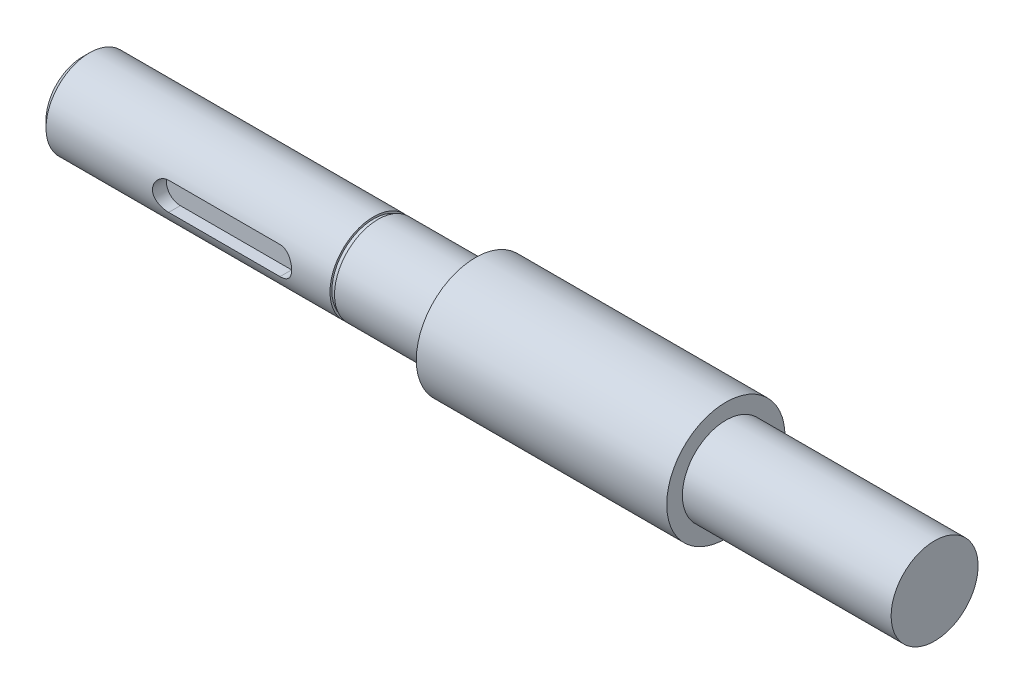
ISO-10303-21;
HEADER;
FILE_DESCRIPTION(('STEP AP214'),'2;1');
FILE_NAME('part.step','',(''),(''),'','','');
FILE_SCHEMA(('AUTOMOTIVE_DESIGN { 1 0 10303 214 1 1 1 1 }'));
ENDSEC;
DATA;
#1=APPLICATION_CONTEXT('core data for automotive mechanical design processes');
#2=APPLICATION_PROTOCOL_DEFINITION('international standard','automotive_design',2000,#1);
#3=PRODUCT_CONTEXT('',#1,'mechanical');
#4=PRODUCT('Part','Part','',(#3));
#5=PRODUCT_RELATED_PRODUCT_CATEGORY('part','',(#4));
#6=PRODUCT_DEFINITION_FORMATION('','',#4);
#7=PRODUCT_DEFINITION_CONTEXT('part definition',#1,'design');
#8=PRODUCT_DEFINITION('design','',#6,#7);
#9=PRODUCT_DEFINITION_SHAPE('','',#8);
#10=(LENGTH_UNIT() NAMED_UNIT(*) SI_UNIT(.MILLI.,.METRE.));
#11=(NAMED_UNIT(*) PLANE_ANGLE_UNIT() SI_UNIT($,.RADIAN.));
#12=(NAMED_UNIT(*) SI_UNIT($,.STERADIAN.) SOLID_ANGLE_UNIT());
#13=UNCERTAINTY_MEASURE_WITH_UNIT(LENGTH_MEASURE(1.E-05),#10,'distance_accuracy_value','');
#14=(GEOMETRIC_REPRESENTATION_CONTEXT(3) GLOBAL_UNCERTAINTY_ASSIGNED_CONTEXT((#13)) GLOBAL_UNIT_ASSIGNED_CONTEXT((#10,
#11,#12)) REPRESENTATION_CONTEXT('',''));
#15=CARTESIAN_POINT('',(0.,0.,0.));
#16=DIRECTION('',(0.,0.,1.));
#17=DIRECTION('',(1.,0.,0.));
#18=AXIS2_PLACEMENT_3D('',#15,#16,#17);
#19=CARTESIAN_POINT('',(0.,0.,0.));
#20=DIRECTION('',(-1.,0.,0.));
#21=DIRECTION('',(0.,0.,1.));
#22=AXIS2_PLACEMENT_3D('',#19,#20,#21);
#23=CYLINDRICAL_SURFACE('',#22,12.5);
#24=DIRECTION('',(-1.,0.,0.));
#25=VECTOR('',#24,1.);
#26=CARTESIAN_POINT('',(0.,4.,-11.842719282327));
#27=LINE('',#26,#25);
#28=CARTESIAN_POINT('',(7.60830044569828,4.,-11.842719282327));
#29=VERTEX_POINT('',#28);
#30=CARTESIAN_POINT('',(-24.3916995543017,4.,-11.842719282327));
#31=VERTEX_POINT('',#30);
#32=EDGE_CURVE('E47',#29,#31,#27,.T.);
#33=ORIENTED_EDGE('',*,*,#32,.T.);
#34=CARTESIAN_POINT('',(-24.3916995543017,4.,-11.842719282327));
#35=CARTESIAN_POINT('',(-24.5010993262633,4.00001410484613,-11.8427027366058));
#36=CARTESIAN_POINT('',(-24.6104897641496,3.995512175201,-11.8442348052368));
#37=CARTESIAN_POINT('',(-24.8284277950382,3.97758606678449,-11.8502730910574));
#38=CARTESIAN_POINT('',(-24.9369755927862,3.96416412872571,-11.8547785613244));
#39=CARTESIAN_POINT('',(-25.1521605851472,3.92855725119429,-11.8666242076309));
#40=CARTESIAN_POINT('',(-25.258802249913,3.9063967602145,-11.8739564736691));
#41=CARTESIAN_POINT('',(-25.4697051926733,3.85353581488656,-11.8912164993788));
#42=CARTESIAN_POINT('',(-25.5739663944585,3.82283508754056,-11.90114434202));
#43=CARTESIAN_POINT('',(-25.8820045585801,3.71831764495512,-11.9343840843196));
#44=CARTESIAN_POINT('',(-26.0813361063698,3.63203544139888,-11.9611699822066));
#45=CARTESIAN_POINT('',(-26.4627121113436,3.42895021192288,-12.0209583955878));
#46=CARTESIAN_POINT('',(-26.6447469333514,3.31213030924909,-12.0539643457894));
#47=CARTESIAN_POINT('',(-26.9929535429009,3.0467850788479,-12.123798407807));
#48=CARTESIAN_POINT('',(-27.1584178786412,2.89735303896514,-12.1607158548651));
#49=CARTESIAN_POINT('',(-27.4624144028906,2.57296449846116,-12.2334561140966));
#50=CARTESIAN_POINT('',(-27.6009419026594,2.39800356343232,-12.2692787347869));
#51=CARTESIAN_POINT('',(-27.8503147526723,2.02237003010512,-12.3368244653945));
#52=CARTESIAN_POINT('',(-27.9604215107714,1.82118394546976,-12.3684294972003));
#53=CARTESIAN_POINT('',(-28.1449490496511,1.40197197350369,-12.4229251649937));
#54=CARTESIAN_POINT('',(-28.2193800280836,1.18395091903581,-12.4458182908278));
#55=CARTESIAN_POINT('',(-28.3280584185522,0.744713961063364,-12.4796767811416));
#56=CARTESIAN_POINT('',(-28.3635244876818,0.523827920101155,-12.4910030499338));
#57=CARTESIAN_POINT('',(-28.3971323533434,0.0789648151746375,-12.5017287122873));
#58=CARTESIAN_POINT('',(-28.3952822878266,-0.145011564197642,-12.5011307063103));
#59=CARTESIAN_POINT('',(-28.3551007250304,-0.581094974437691,-12.4883236673358));
#60=CARTESIAN_POINT('',(-28.3180917863229,-0.793338226675238,-12.4765355800409));
#61=CARTESIAN_POINT('',(-28.2108190026954,-1.2084232001272,-12.443194578958));
#62=CARTESIAN_POINT('',(-28.1405533468689,-1.41126440871778,-12.4216411334261));
#63=CARTESIAN_POINT('',(-27.967941712066,-1.80478548808183,-12.3706364987475));
#64=CARTESIAN_POINT('',(-27.8652030344329,-1.99528012693527,-12.3410893067347));
#65=CARTESIAN_POINT('',(-27.6308705052565,-2.35673113106229,-12.2771965403044));
#66=CARTESIAN_POINT('',(-27.4992693478987,-2.5276825327575,-12.2428497517893));
#67=CARTESIAN_POINT('',(-27.2042530230102,-2.85304511528221,-12.1712409097156));
#68=CARTESIAN_POINT('',(-27.0397028517096,-3.00641313381737,-12.1339170352569));
#69=CARTESIAN_POINT('',(-26.6867276542164,-3.28377291775701,-12.0618172896256));
#70=CARTESIAN_POINT('',(-26.4982952954696,-3.40775562728565,-12.0270422062066));
#71=CARTESIAN_POINT('',(-26.2003283165531,-3.56958208232607,-11.9796198433082));
#72=CARTESIAN_POINT('',(-26.0977004950602,-3.61975674493765,-11.9645161845072));
#73=CARTESIAN_POINT('',(-25.88829480155,-3.71123075156255,-11.9364591580623));
#74=CARTESIAN_POINT('',(-25.7815186665153,-3.75253376401034,-11.9235049021446));
#75=CARTESIAN_POINT('',(-25.5646862264101,-3.82585831579179,-11.9001802342949));
#76=CARTESIAN_POINT('',(-25.4546335763286,-3.85788979915529,-11.889807055759));
#77=CARTESIAN_POINT('',(-25.2320043973541,-3.91241790563964,-11.8719756673203));
#78=CARTESIAN_POINT('',(-25.1194290505043,-3.93491889994975,-11.8645161211931));
#79=CARTESIAN_POINT('',(-24.9044603084407,-3.96832908530803,-11.8533815888388));
#80=CARTESIAN_POINT('',(-24.8022321385071,-3.9802038456482,-11.8493925948395));
#81=CARTESIAN_POINT('',(-24.5972384762684,-3.99603937127681,-11.8440568016292));
#82=CARTESIAN_POINT('',(-24.4944739160212,-4.00001099551563,-11.8427063770563));
#83=CARTESIAN_POINT('',(-24.3916995543017,-4.,-11.842719282327));
#84=B_SPLINE_CURVE_WITH_KNOTS('',3,(#34,#35,#36,#37,#38,#39,#40,#41,#42,#43,#44,#45,#46,#47,#48,
#49,#50,#51,#52,#53,#54,#55,#56,#57,#58,#59,#60,#61,#62,#63,#64,#65,#66,#67,#68,#69,#70,#71,#72,
#73,#74,#75,#76,#77,#78,#79,#80,#81,#82,#83),.UNSPECIFIED.,.F.,.F.,(4,2,2,2,2,2,2,2,2,2,2,2,2,2,
2,2,2,2,2,2,2,2,2,2,4),(0.,0.328080176984104,0.656077971124949,0.983164539368217,
1.31026156448799,1.96355293984247,2.61720612481382,3.29209427898755,3.96709980211697,
4.65819584662373,5.34909422856993,6.01770820975085,6.68617638029994,7.3304550155383,
7.97476873730064,8.6271932010581,9.27978300073407,9.96076419384898,10.6419549776068,
10.9872862883783,11.3324745283028,11.6772911585126,12.0219494657669,12.3305938648259,
12.6388138912331),.UNSPECIFIED.);
#85=CARTESIAN_POINT('',(-24.3916995543017,-4.,-11.842719282327));
#86=VERTEX_POINT('',#85);
#87=EDGE_CURVE('E11',#31,#86,#84,.T.);
#88=ORIENTED_EDGE('',*,*,#87,.T.);
#89=DIRECTION('',(-1.,0.,0.));
#90=VECTOR('',#89,1.);
#91=CARTESIAN_POINT('',(0.,-4.,-11.842719282327));
#92=LINE('',#91,#90);
#93=CARTESIAN_POINT('',(7.60830044569827,-4.,-11.842719282327));
#94=VERTEX_POINT('',#93);
#95=EDGE_CURVE('E107',#86,#94,#92,.F.);
#96=ORIENTED_EDGE('',*,*,#95,.T.);
#97=CARTESIAN_POINT('',(7.60830044569827,-4.,-11.842719282327));
#98=CARTESIAN_POINT('',(7.71770021765987,-4.00001410484613,-11.8427027366058));
#99=CARTESIAN_POINT('',(7.82709065554617,-3.995512175201,-11.8442348052368));
#100=CARTESIAN_POINT('',(8.04502868643475,-3.97758606678449,-11.8502730910574));
#101=CARTESIAN_POINT('',(8.15357648418277,-3.96416412872571,-11.8547785613244));
#102=CARTESIAN_POINT('',(8.36876147654376,-3.92855725119429,-11.8666242076309));
#103=CARTESIAN_POINT('',(8.47540314130951,-3.9063967602145,-11.8739564736691));
#104=CARTESIAN_POINT('',(8.68630608406984,-3.85353581488656,-11.8912164993788));
#105=CARTESIAN_POINT('',(8.79056728585505,-3.82283508754056,-11.90114434202));
#106=CARTESIAN_POINT('',(9.09860544997663,-3.71831764495512,-11.9343840843196));
#107=CARTESIAN_POINT('',(9.29793699776631,-3.63203544139887,-11.9611699822066));
#108=CARTESIAN_POINT('',(9.67931300274012,-3.42895021192288,-12.0209583955878));
#109=CARTESIAN_POINT('',(9.86134782474794,-3.31213030924909,-12.0539643457894));
#110=CARTESIAN_POINT('',(10.2095544342975,-3.0467850788479,-12.123798407807));
#111=CARTESIAN_POINT('',(10.3750187700377,-2.89735303896514,-12.1607158548651));
#112=CARTESIAN_POINT('',(10.6790152942872,-2.57296449846116,-12.2334561140966));
#113=CARTESIAN_POINT('',(10.817542794056,-2.39800356343232,-12.2692787347869));
#114=CARTESIAN_POINT('',(11.0669156440688,-2.02237003010512,-12.3368244653945));
#115=CARTESIAN_POINT('',(11.1770224021679,-1.82118394546976,-12.3684294972003));
#116=CARTESIAN_POINT('',(11.3615499410477,-1.40197197350368,-12.4229251649937));
#117=CARTESIAN_POINT('',(11.4359809194802,-1.18395091903581,-12.4458182908278));
#118=CARTESIAN_POINT('',(11.5446593099488,-0.744713961063361,-12.4796767811416));
#119=CARTESIAN_POINT('',(11.5801253790784,-0.523827920101152,-12.4910030499338));
#120=CARTESIAN_POINT('',(11.6137332447399,-0.0789648151746353,-12.5017287122873));
#121=CARTESIAN_POINT('',(11.6118831792231,0.145011564197644,-12.5011307063103));
#122=CARTESIAN_POINT('',(11.5717016164269,0.581094974437693,-12.4883236673358));
#123=CARTESIAN_POINT('',(11.5346926777195,0.79333822667524,-12.4765355800409));
#124=CARTESIAN_POINT('',(11.427419894092,1.20842320012721,-12.443194578958));
#125=CARTESIAN_POINT('',(11.3571542382655,1.41126440871778,-12.4216411334261));
#126=CARTESIAN_POINT('',(11.1845426034625,1.80478548808183,-12.3706364987475));
#127=CARTESIAN_POINT('',(11.0818039258295,1.99528012693527,-12.3410893067347));
#128=CARTESIAN_POINT('',(10.8474713966531,2.35673113106229,-12.2771965403044));
#129=CARTESIAN_POINT('',(10.7158702392953,2.5276825327575,-12.2428497517893));
#130=CARTESIAN_POINT('',(10.4208539144067,2.85304511528221,-12.1712409097156));
#131=CARTESIAN_POINT('',(10.2563037431062,3.00641313381737,-12.1339170352569));
#132=CARTESIAN_POINT('',(9.90332854561297,3.28377291775701,-12.0618172896256));
#133=CARTESIAN_POINT('',(9.71489618686613,3.40775562728565,-12.0270422062066));
#134=CARTESIAN_POINT('',(9.41692920794968,3.56958208232607,-11.9796198433082));
#135=CARTESIAN_POINT('',(9.31430138645673,3.61975674493765,-11.9645161845072));
#136=CARTESIAN_POINT('',(9.10489569294658,3.71123075156255,-11.9364591580623));
#137=CARTESIAN_POINT('',(8.99811955791186,3.75253376401034,-11.9235049021446));
#138=CARTESIAN_POINT('',(8.78128711780664,3.82585831579179,-11.9001802342949));
#139=CARTESIAN_POINT('',(8.67123446772515,3.85788979915529,-11.889807055759));
#140=CARTESIAN_POINT('',(8.44860528875068,3.91241790563964,-11.8719756673203));
#141=CARTESIAN_POINT('',(8.33602994190084,3.93491889994975,-11.8645161211931));
#142=CARTESIAN_POINT('',(8.12106119983729,3.96832908530803,-11.8533815888388));
#143=CARTESIAN_POINT('',(8.01883302990367,3.9802038456482,-11.8493925948395));
#144=CARTESIAN_POINT('',(7.81383936766496,3.99603937127681,-11.8440568016292));
#145=CARTESIAN_POINT('',(7.71107480741774,4.00001099551563,-11.8427063770563));
#146=CARTESIAN_POINT('',(7.60830044569828,4.,-11.842719282327));
#147=B_SPLINE_CURVE_WITH_KNOTS('',3,(#97,#98,#99,#100,#101,#102,#103,#104,#105,#106,#107,#108,
#109,#110,#111,#112,#113,#114,#115,#116,#117,#118,#119,#120,#121,#122,#123,#124,#125,#126,#127,
#128,#129,#130,#131,#132,#133,#134,#135,#136,#137,#138,#139,#140,#141,#142,#143,#144,#145,#146),
.UNSPECIFIED.,.F.,.F.,(4,2,2,2,2,2,2,2,2,2,2,2,2,2,2,2,2,2,2,2,2,2,2,2,4),(0.,0.328080176984103,
0.656077971124949,0.983164539368218,1.310261564488,1.96355293984248,2.61720612481382,
3.29209427898756,3.96709980211697,4.65819584662374,5.34909422856993,6.01770820975086,
6.68617638029994,7.3304550155383,7.97476873730065,8.6271932010581,9.27978300073407,
9.96076419384898,10.6419549776068,10.9872862883783,11.3324745283028,11.6772911585126,
12.0219494657669,12.3305938648259,12.6388138912331),.UNSPECIFIED.);
#148=EDGE_CURVE('E227',#94,#29,#147,.T.);
#149=ORIENTED_EDGE('',*,*,#148,.T.);
#150=EDGE_LOOP('',(#33,#88,#96,#149));
#151=FACE_BOUND('',#150,.T.);
#152=CARTESIAN_POINT('',(-59.,0.,0.));
#153=DIRECTION('',(-1.,0.,0.));
#154=DIRECTION('',(0.,0.,1.));
#155=AXIS2_PLACEMENT_3D('',#152,#153,#154);
#156=CIRCLE('',#155,12.5);
#157=CARTESIAN_POINT('',(-59.,0.,12.5));
#158=VERTEX_POINT('',#157);
#159=EDGE_CURVE('E162',#158,#158,#156,.T.);
#160=ORIENTED_EDGE('',*,*,#159,.F.);
#161=EDGE_LOOP('',(#160));
#162=FACE_BOUND('',#161,.T.);
#163=CARTESIAN_POINT('',(22.64,0.,0.));
#164=DIRECTION('',(-1.,0.,0.));
#165=DIRECTION('',(0.,0.,1.));
#166=AXIS2_PLACEMENT_3D('',#163,#164,#165);
#167=CIRCLE('',#166,12.5);
#168=CARTESIAN_POINT('',(22.64,0.,12.5));
#169=VERTEX_POINT('',#168);
#170=EDGE_CURVE('E163',#169,#169,#167,.T.);
#171=ORIENTED_EDGE('',*,*,#170,.T.);
#172=EDGE_LOOP('',(#171));
#173=FACE_BOUND('',#172,.T.);
#174=CARTESIAN_POINT('',(-24.3916995543017,4.,11.842719282327));
#175=CARTESIAN_POINT('',(-24.5010993262633,4.00001410484613,11.8427027366058));
#176=CARTESIAN_POINT('',(-24.6104897641496,3.995512175201,11.8442348052368));
#177=CARTESIAN_POINT('',(-24.8284277950382,3.97758606678449,11.8502730910574));
#178=CARTESIAN_POINT('',(-24.9369755927862,3.96416412872571,11.8547785613244));
#179=CARTESIAN_POINT('',(-25.1521605851472,3.92855725119429,11.8666242076309));
#180=CARTESIAN_POINT('',(-25.258802249913,3.9063967602145,11.8739564736691));
#181=CARTESIAN_POINT('',(-25.4697051926733,3.85353581488656,11.8912164993788));
#182=CARTESIAN_POINT('',(-25.5739663944585,3.82283508754056,11.90114434202));
#183=CARTESIAN_POINT('',(-25.8820045585801,3.71831764495512,11.9343840843196));
#184=CARTESIAN_POINT('',(-26.0813361063698,3.63203544139888,11.9611699822066));
#185=CARTESIAN_POINT('',(-26.4627121113436,3.42895021192288,12.0209583955878));
#186=CARTESIAN_POINT('',(-26.6447469333514,3.31213030924909,12.0539643457894));
#187=CARTESIAN_POINT('',(-26.9929535429009,3.0467850788479,12.123798407807));
#188=CARTESIAN_POINT('',(-27.1584178786412,2.89735303896514,12.1607158548651));
#189=CARTESIAN_POINT('',(-27.4624144028906,2.57296449846116,12.2334561140966));
#190=CARTESIAN_POINT('',(-27.6009419026594,2.39800356343232,12.2692787347869));
#191=CARTESIAN_POINT('',(-27.8503147526723,2.02237003010512,12.3368244653945));
#192=CARTESIAN_POINT('',(-27.9604215107714,1.82118394546976,12.3684294972003));
#193=CARTESIAN_POINT('',(-28.1449490496511,1.40197197350369,12.4229251649937));
#194=CARTESIAN_POINT('',(-28.2193800280836,1.18395091903581,12.4458182908278));
#195=CARTESIAN_POINT('',(-28.3280584185522,0.744713961063364,12.4796767811416));
#196=CARTESIAN_POINT('',(-28.3635244876818,0.523827920101155,12.4910030499338));
#197=CARTESIAN_POINT('',(-28.3971323533434,0.0789648151746375,12.5017287122873));
#198=CARTESIAN_POINT('',(-28.3952822878266,-0.145011564197642,12.5011307063103));
#199=CARTESIAN_POINT('',(-28.3551007250304,-0.581094974437691,12.4883236673358));
#200=CARTESIAN_POINT('',(-28.3180917863229,-0.793338226675238,12.4765355800409));
#201=CARTESIAN_POINT('',(-28.2108190026954,-1.2084232001272,12.443194578958));
#202=CARTESIAN_POINT('',(-28.1405533468689,-1.41126440871778,12.4216411334261));
#203=CARTESIAN_POINT('',(-27.967941712066,-1.80478548808183,12.3706364987475));
#204=CARTESIAN_POINT('',(-27.8652030344329,-1.99528012693527,12.3410893067347));
#205=CARTESIAN_POINT('',(-27.6308705052565,-2.35673113106229,12.2771965403044));
#206=CARTESIAN_POINT('',(-27.4992693478987,-2.5276825327575,12.2428497517893));
#207=CARTESIAN_POINT('',(-27.2042530230102,-2.85304511528221,12.1712409097156));
#208=CARTESIAN_POINT('',(-27.0397028517096,-3.00641313381737,12.1339170352569));
#209=CARTESIAN_POINT('',(-26.6867276542164,-3.28377291775701,12.0618172896256));
#210=CARTESIAN_POINT('',(-26.4982952954696,-3.40775562728565,12.0270422062066));
#211=CARTESIAN_POINT('',(-26.2003283165531,-3.56958208232607,11.9796198433082));
#212=CARTESIAN_POINT('',(-26.0977004950602,-3.61975674493765,11.9645161845072));
#213=CARTESIAN_POINT('',(-25.88829480155,-3.71123075156255,11.9364591580623));
#214=CARTESIAN_POINT('',(-25.7815186665153,-3.75253376401034,11.9235049021446));
#215=CARTESIAN_POINT('',(-25.5646862264101,-3.82585831579179,11.9001802342949));
#216=CARTESIAN_POINT('',(-25.4546335763286,-3.85788979915529,11.889807055759));
#217=CARTESIAN_POINT('',(-25.2320043973541,-3.91241790563964,11.8719756673203));
#218=CARTESIAN_POINT('',(-25.1194290505043,-3.93491889994975,11.8645161211931));
#219=CARTESIAN_POINT('',(-24.9044603084407,-3.96832908530803,11.8533815888388));
#220=CARTESIAN_POINT('',(-24.8022321385071,-3.9802038456482,11.8493925948395));
#221=CARTESIAN_POINT('',(-24.5972384762684,-3.99603937127681,11.8440568016292));
#222=CARTESIAN_POINT('',(-24.4944739160212,-4.00001099551563,11.8427063770563));
#223=CARTESIAN_POINT('',(-24.3916995543017,-4.,11.842719282327));
#224=B_SPLINE_CURVE_WITH_KNOTS('',3,(#174,#175,#176,#177,#178,#179,#180,#181,#182,#183,#184,
#185,#186,#187,#188,#189,#190,#191,#192,#193,#194,#195,#196,#197,#198,#199,#200,#201,#202,#203,
#204,#205,#206,#207,#208,#209,#210,#211,#212,#213,#214,#215,#216,#217,#218,#219,#220,#221,#222,
#223),.UNSPECIFIED.,.F.,.F.,(4,2,2,2,2,2,2,2,2,2,2,2,2,2,2,2,2,2,2,2,2,2,2,2,4),(0.,
0.328080176984104,0.656077971124949,0.983164539368217,1.31026156448799,1.96355293984247,
2.61720612481382,3.29209427898755,3.96709980211697,4.65819584662373,5.34909422856993,
6.01770820975085,6.68617638029994,7.3304550155383,7.97476873730064,8.6271932010581,
9.27978300073407,9.96076419384898,10.6419549776068,10.9872862883783,11.3324745283028,
11.6772911585126,12.0219494657669,12.3305938648259,12.6388138912331),.UNSPECIFIED.);
#225=CARTESIAN_POINT('',(-24.3916995543017,4.,11.842719282327));
#226=VERTEX_POINT('',#225);
#227=CARTESIAN_POINT('',(-24.3916995543017,-4.,11.842719282327));
#228=VERTEX_POINT('',#227);
#229=EDGE_CURVE('E220',#226,#228,#224,.T.);
#230=ORIENTED_EDGE('',*,*,#229,.F.);
#231=DIRECTION('',(-1.,0.,0.));
#232=VECTOR('',#231,1.);
#233=CARTESIAN_POINT('',(0.,4.,11.842719282327));
#234=LINE('',#233,#232);
#235=CARTESIAN_POINT('',(7.60830044569828,4.,11.842719282327));
#236=VERTEX_POINT('',#235);
#237=EDGE_CURVE('E181',#236,#226,#234,.T.);
#238=ORIENTED_EDGE('',*,*,#237,.F.);
#239=CARTESIAN_POINT('',(7.60830044569828,-4.,11.842719282327));
#240=CARTESIAN_POINT('',(7.71770021765987,-4.00001410484613,11.8427027366058));
#241=CARTESIAN_POINT('',(7.82709065554618,-3.995512175201,11.8442348052368));
#242=CARTESIAN_POINT('',(8.04502868643475,-3.97758606678449,11.8502730910574));
#243=CARTESIAN_POINT('',(8.15357648418277,-3.96416412872571,11.8547785613244));
#244=CARTESIAN_POINT('',(8.36876147654377,-3.92855725119429,11.8666242076309));
#245=CARTESIAN_POINT('',(8.47540314130951,-3.9063967602145,11.8739564736691));
#246=CARTESIAN_POINT('',(8.68630608406984,-3.85353581488656,11.8912164993788));
#247=CARTESIAN_POINT('',(8.79056728585505,-3.82283508754056,11.90114434202));
#248=CARTESIAN_POINT('',(9.09860544997663,-3.71831764495512,11.9343840843196));
#249=CARTESIAN_POINT('',(9.29793699776631,-3.63203544139887,11.9611699822066));
#250=CARTESIAN_POINT('',(9.67931300274012,-3.42895021192288,12.0209583955878));
#251=CARTESIAN_POINT('',(9.86134782474794,-3.31213030924909,12.0539643457894));
#252=CARTESIAN_POINT('',(10.2095544342975,-3.0467850788479,12.123798407807));
#253=CARTESIAN_POINT('',(10.3750187700377,-2.89735303896514,12.1607158548651));
#254=CARTESIAN_POINT('',(10.6790152942872,-2.57296449846116,12.2334561140966));
#255=CARTESIAN_POINT('',(10.817542794056,-2.39800356343232,12.2692787347869));
#256=CARTESIAN_POINT('',(11.0669156440688,-2.02237003010512,12.3368244653945));
#257=CARTESIAN_POINT('',(11.1770224021679,-1.82118394546976,12.3684294972003));
#258=CARTESIAN_POINT('',(11.3615499410477,-1.40197197350368,12.4229251649937));
#259=CARTESIAN_POINT('',(11.4359809194802,-1.18395091903581,12.4458182908278));
#260=CARTESIAN_POINT('',(11.5446593099488,-0.744713961063361,12.4796767811416));
#261=CARTESIAN_POINT('',(11.5801253790784,-0.523827920101152,12.4910030499338));
#262=CARTESIAN_POINT('',(11.6137332447399,-0.0789648151746353,12.5017287122873));
#263=CARTESIAN_POINT('',(11.6118831792231,0.145011564197643,12.5011307063103));
#264=CARTESIAN_POINT('',(11.5717016164269,0.581094974437693,12.4883236673358));
#265=CARTESIAN_POINT('',(11.5346926777195,0.79333822667524,12.4765355800409));
#266=CARTESIAN_POINT('',(11.427419894092,1.20842320012721,12.443194578958));
#267=CARTESIAN_POINT('',(11.3571542382655,1.41126440871778,12.4216411334261));
#268=CARTESIAN_POINT('',(11.1845426034625,1.80478548808183,12.3706364987475));
#269=CARTESIAN_POINT('',(11.0818039258295,1.99528012693527,12.3410893067347));
#270=CARTESIAN_POINT('',(10.8474713966531,2.35673113106229,12.2771965403044));
#271=CARTESIAN_POINT('',(10.7158702392953,2.52768253275751,12.2428497517893));
#272=CARTESIAN_POINT('',(10.4208539144067,2.85304511528221,12.1712409097156));
#273=CARTESIAN_POINT('',(10.2563037431062,3.00641313381737,12.1339170352569));
#274=CARTESIAN_POINT('',(9.90332854561297,3.28377291775701,12.0618172896256));
#275=CARTESIAN_POINT('',(9.71489618686613,3.40775562728565,12.0270422062066));
#276=CARTESIAN_POINT('',(9.41692920794968,3.56958208232607,11.9796198433082));
#277=CARTESIAN_POINT('',(9.31430138645673,3.61975674493765,11.9645161845072));
#278=CARTESIAN_POINT('',(9.10489569294658,3.71123075156255,11.9364591580623));
#279=CARTESIAN_POINT('',(8.99811955791186,3.75253376401034,11.9235049021446));
#280=CARTESIAN_POINT('',(8.78128711780664,3.82585831579179,11.9001802342949));
#281=CARTESIAN_POINT('',(8.67123446772515,3.85788979915529,11.889807055759));
#282=CARTESIAN_POINT('',(8.44860528875068,3.91241790563964,11.8719756673203));
#283=CARTESIAN_POINT('',(8.33602994190084,3.93491889994975,11.8645161211931));
#284=CARTESIAN_POINT('',(8.12106119983729,3.96832908530803,11.8533815888388));
#285=CARTESIAN_POINT('',(8.01883302990367,3.9802038456482,11.8493925948395));
#286=CARTESIAN_POINT('',(7.81383936766496,3.99603937127681,11.8440568016292));
#287=CARTESIAN_POINT('',(7.71107480741774,4.00001099551563,11.8427063770563));
#288=CARTESIAN_POINT('',(7.60830044569828,4.,11.842719282327));
#289=B_SPLINE_CURVE_WITH_KNOTS('',3,(#239,#240,#241,#242,#243,#244,#245,#246,#247,#248,#249,
#250,#251,#252,#253,#254,#255,#256,#257,#258,#259,#260,#261,#262,#263,#264,#265,#266,#267,#268,
#269,#270,#271,#272,#273,#274,#275,#276,#277,#278,#279,#280,#281,#282,#283,#284,#285,#286,#287,
#288),.UNSPECIFIED.,.F.,.F.,(4,2,2,2,2,2,2,2,2,2,2,2,2,2,2,2,2,2,2,2,2,2,2,2,4),(0.,
0.328080176984103,0.656077971124949,0.983164539368219,1.310261564488,1.96355293984248,
2.61720612481382,3.29209427898756,3.96709980211697,4.65819584662373,5.34909422856993,
6.01770820975085,6.68617638029993,7.3304550155383,7.97476873730064,8.6271932010581,
9.27978300073407,9.96076419384897,10.6419549776068,10.9872862883783,11.3324745283028,
11.6772911585126,12.0219494657669,12.3305938648259,12.6388138912331),.UNSPECIFIED.);
#290=CARTESIAN_POINT('',(7.60830044569827,-4.,11.842719282327));
#291=VERTEX_POINT('',#290);
#292=EDGE_CURVE('E187',#291,#236,#289,.T.);
#293=ORIENTED_EDGE('',*,*,#292,.F.);
#294=DIRECTION('',(-1.,0.,0.));
#295=VECTOR('',#294,1.);
#296=CARTESIAN_POINT('',(0.,-4.,11.842719282327));
#297=LINE('',#296,#295);
#298=EDGE_CURVE('E194',#228,#291,#297,.F.);
#299=ORIENTED_EDGE('',*,*,#298,.F.);
#300=EDGE_LOOP('',(#230,#238,#293,#299));
#301=FACE_BOUND('',#300,.T.);
#302=ADVANCED_FACE('F33',(#151,#162,#173,#301),#23,.T.);
#303=CARTESIAN_POINT('',(183.94487975669,0.,0.));
#304=DIRECTION('',(-1.,0.,0.));
#305=DIRECTION('',(0.,0.,1.));
#306=AXIS2_PLACEMENT_3D('',#303,#304,#305);
#307=PLANE('',#306);
#308=CARTESIAN_POINT('',(183.94487975669,0.,0.));
#309=DIRECTION('',(-1.,0.,0.));
#310=DIRECTION('',(0.,0.,1.));
#311=AXIS2_PLACEMENT_3D('',#308,#309,#310);
#312=CIRCLE('',#311,12.5);
#313=CARTESIAN_POINT('',(183.94487975669,0.,12.5));
#314=VERTEX_POINT('',#313);
#315=EDGE_CURVE('E178',#314,#314,#312,.T.);
#316=ORIENTED_EDGE('',*,*,#315,.F.);
#317=EDGE_LOOP('',(#316));
#318=FACE_BOUND('',#317,.T.);
#319=ADVANCED_FACE('F252',(#318),#307,.F.);
#320=CARTESIAN_POINT('',(0.,0.,0.));
#321=DIRECTION('',(-1.,0.,0.));
#322=DIRECTION('',(0.,0.,1.));
#323=AXIS2_PLACEMENT_3D('',#320,#321,#322);
#324=CYLINDRICAL_SURFACE('',#323,12.5);
#325=CARTESIAN_POINT('',(123.94487975669,0.,0.));
#326=DIRECTION('',(-1.,0.,0.));
#327=DIRECTION('',(0.,0.,1.));
#328=AXIS2_PLACEMENT_3D('',#325,#326,#327);
#329=CIRCLE('',#328,12.5);
#330=CARTESIAN_POINT('',(123.94487975669,0.,12.5));
#331=VERTEX_POINT('',#330);
#332=EDGE_CURVE('E175',#331,#331,#329,.T.);
#333=ORIENTED_EDGE('',*,*,#332,.F.);
#334=EDGE_LOOP('',(#333));
#335=FACE_BOUND('',#334,.T.);
#336=ORIENTED_EDGE('',*,*,#315,.T.);
#337=EDGE_LOOP('',(#336));
#338=FACE_BOUND('',#337,.T.);
#339=ADVANCED_FACE('F257',(#335,#338),#324,.T.);
#340=CARTESIAN_POINT('',(123.94487975669,17.,0.));
#341=DIRECTION('',(-1.,0.,0.));
#342=DIRECTION('',(0.,0.,1.));
#343=AXIS2_PLACEMENT_3D('',#340,#341,#342);
#344=PLANE('',#343);
#345=CARTESIAN_POINT('',(123.94487975669,0.,0.));
#346=DIRECTION('',(-1.,0.,0.));
#347=DIRECTION('',(0.,0.,1.));
#348=AXIS2_PLACEMENT_3D('',#345,#346,#347);
#349=CIRCLE('',#348,17.);
#350=CARTESIAN_POINT('',(123.94487975669,0.,17.));
#351=VERTEX_POINT('',#350);
#352=EDGE_CURVE('E172',#351,#351,#349,.T.);
#353=ORIENTED_EDGE('',*,*,#352,.F.);
#354=EDGE_LOOP('',(#353));
#355=FACE_BOUND('',#354,.T.);
#356=ORIENTED_EDGE('',*,*,#332,.T.);
#357=EDGE_LOOP('',(#356));
#358=FACE_BOUND('',#357,.T.);
#359=ADVANCED_FACE('F281',(#355,#358),#344,.F.);
#360=CARTESIAN_POINT('',(0.,0.,0.));
#361=DIRECTION('',(-1.,0.,0.));
#362=DIRECTION('',(0.,0.,1.));
#363=AXIS2_PLACEMENT_3D('',#360,#361,#362);
#364=CYLINDRICAL_SURFACE('',#363,17.);
#365=CARTESIAN_POINT('',(51.9448797566904,0.,0.));
#366=DIRECTION('',(-1.,0.,0.));
#367=DIRECTION('',(0.,0.,1.));
#368=AXIS2_PLACEMENT_3D('',#365,#366,#367);
#369=CIRCLE('',#368,17.);
#370=CARTESIAN_POINT('',(51.9448797566904,0.,17.));
#371=VERTEX_POINT('',#370);
#372=EDGE_CURVE('E169',#371,#371,#369,.T.);
#373=ORIENTED_EDGE('',*,*,#372,.F.);
#374=EDGE_LOOP('',(#373));
#375=FACE_BOUND('',#374,.T.);
#376=ORIENTED_EDGE('',*,*,#352,.T.);
#377=EDGE_LOOP('',(#376));
#378=FACE_BOUND('',#377,.T.);
#379=ADVANCED_FACE('F271',(#375,#378),#364,.T.);
#380=CARTESIAN_POINT('',(51.9448797566904,12.5,0.));
#381=DIRECTION('',(1.,0.,0.));
#382=DIRECTION('',(0.,0.,-1.));
#383=AXIS2_PLACEMENT_3D('',#380,#381,#382);
#384=PLANE('',#383);
#385=CARTESIAN_POINT('',(51.9448797566904,0.,0.));
#386=DIRECTION('',(-1.,0.,0.));
#387=DIRECTION('',(0.,0.,1.));
#388=AXIS2_PLACEMENT_3D('',#385,#386,#387);
#389=CIRCLE('',#388,12.5);
#390=CARTESIAN_POINT('',(51.9448797566904,0.,12.5));
#391=VERTEX_POINT('',#390);
#392=EDGE_CURVE('E166',#391,#391,#389,.T.);
#393=ORIENTED_EDGE('',*,*,#392,.F.);
#394=EDGE_LOOP('',(#393));
#395=FACE_BOUND('',#394,.T.);
#396=ORIENTED_EDGE('',*,*,#372,.T.);
#397=EDGE_LOOP('',(#396));
#398=FACE_BOUND('',#397,.T.);
#399=ADVANCED_FACE('F263',(#395,#398),#384,.F.);
#400=CARTESIAN_POINT('',(23.94,0.,0.));
#401=DIRECTION('',(1.,0.,0.));
#402=DIRECTION('',(0.,0.,-1.));
#403=AXIS2_PLACEMENT_3D('',#400,#401,#402);
#404=CIRCLE('',#403,12.5);
#405=CARTESIAN_POINT('',(23.94,0.,-12.5));
#406=VERTEX_POINT('',#405);
#407=EDGE_CURVE('E158',#406,#406,#404,.T.);
#408=ORIENTED_EDGE('',*,*,#407,.T.);
#409=EDGE_LOOP('',(#408));
#410=FACE_BOUND('',#409,.T.);
#411=ORIENTED_EDGE('',*,*,#392,.T.);
#412=EDGE_LOOP('',(#411));
#413=FACE_BOUND('',#412,.T.);
#414=ADVANCED_FACE('F196',(#410,#413),#23,.T.);
#415=CARTESIAN_POINT('',(22.64,0.,13.7786439185524));
#416=DIRECTION('',(-1.,0.,0.));
#417=DIRECTION('',(0.,0.,1.));
#418=AXIS2_PLACEMENT_3D('',#415,#416,#417);
#419=PLANE('',#418);
#420=CARTESIAN_POINT('',(22.64,0.,0.));
#421=DIRECTION('',(-1.,0.,0.));
#422=DIRECTION('',(0.,0.,1.));
#423=AXIS2_PLACEMENT_3D('',#420,#421,#422);
#424=CIRCLE('',#423,11.95);
#425=CARTESIAN_POINT('',(22.64,0.,11.95));
#426=VERTEX_POINT('',#425);
#427=EDGE_CURVE('E155',#426,#426,#424,.T.);
#428=ORIENTED_EDGE('',*,*,#427,.T.);
#429=EDGE_LOOP('',(#428));
#430=FACE_BOUND('',#429,.T.);
#431=ORIENTED_EDGE('',*,*,#170,.F.);
#432=EDGE_LOOP('',(#431));
#433=FACE_BOUND('',#432,.T.);
#434=ADVANCED_FACE('F262',(#430,#433),#419,.F.);
#435=CARTESIAN_POINT('',(23.94,0.,13.7786439185524));
#436=DIRECTION('',(1.,0.,0.));
#437=DIRECTION('',(0.,0.,-1.));
#438=AXIS2_PLACEMENT_3D('',#435,#436,#437);
#439=PLANE('',#438);
#440=CARTESIAN_POINT('',(23.94,0.,0.));
#441=DIRECTION('',(-1.,0.,0.));
#442=DIRECTION('',(0.,0.,1.));
#443=AXIS2_PLACEMENT_3D('',#440,#441,#442);
#444=CIRCLE('',#443,11.95);
#445=CARTESIAN_POINT('',(23.94,0.,11.95));
#446=VERTEX_POINT('',#445);
#447=EDGE_CURVE('E152',#446,#446,#444,.T.);
#448=ORIENTED_EDGE('',*,*,#447,.F.);
#449=EDGE_LOOP('',(#448));
#450=FACE_BOUND('',#449,.T.);
#451=ORIENTED_EDGE('',*,*,#407,.F.);
#452=EDGE_LOOP('',(#451));
#453=FACE_BOUND('',#452,.T.);
#454=ADVANCED_FACE('F218',(#450,#453),#439,.F.);
#455=CARTESIAN_POINT('',(0.,0.,0.));
#456=DIRECTION('',(-1.,0.,0.));
#457=DIRECTION('',(0.,0.,1.));
#458=AXIS2_PLACEMENT_3D('',#455,#456,#457);
#459=CYLINDRICAL_SURFACE('',#458,11.95);
#460=ORIENTED_EDGE('',*,*,#427,.F.);
#461=EDGE_LOOP('',(#460));
#462=FACE_BOUND('',#461,.T.);
#463=ORIENTED_EDGE('',*,*,#447,.T.);
#464=EDGE_LOOP('',(#463));
#465=FACE_BOUND('',#464,.T.);
#466=ADVANCED_FACE('F339',(#462,#465),#459,.T.);
#467=CARTESIAN_POINT('',(-61.,0.,0.));
#468=DIRECTION('',(1.,0.,0.));
#469=DIRECTION('',(0.,0.,-1.));
#470=AXIS2_PLACEMENT_3D('',#467,#468,#469);
#471=PLANE('',#470);
#472=CARTESIAN_POINT('',(-61.,0.,0.));
#473=DIRECTION('',(-1.,0.,0.));
#474=DIRECTION('',(0.,0.,1.));
#475=AXIS2_PLACEMENT_3D('',#472,#473,#474);
#476=CIRCLE('',#475,10.5);
#477=CARTESIAN_POINT('',(-61.,0.,10.5));
#478=VERTEX_POINT('',#477);
#479=EDGE_CURVE('E159',#478,#478,#476,.T.);
#480=ORIENTED_EDGE('',*,*,#479,.T.);
#481=EDGE_LOOP('',(#480));
#482=FACE_BOUND('',#481,.T.);
#483=ADVANCED_FACE('F35',(#482),#471,.F.);
#484=CARTESIAN_POINT('',(-59.,0.,0.));
#485=DIRECTION('',(1.,0.,0.));
#486=DIRECTION('',(0.,0.,-1.));
#487=AXIS2_PLACEMENT_3D('',#484,#485,#486);
#488=CONICAL_SURFACE('',#487,12.5,0.785398163397448);
#489=ORIENTED_EDGE('',*,*,#479,.F.);
#490=EDGE_LOOP('',(#489));
#491=FACE_BOUND('',#490,.T.);
#492=ORIENTED_EDGE('',*,*,#159,.T.);
#493=EDGE_LOOP('',(#492));
#494=FACE_BOUND('',#493,.T.);
#495=ADVANCED_FACE('F216',(#491,#494),#488,.T.);
#496=CARTESIAN_POINT('',(-24.3916995543017,0.,18.5));
#497=DIRECTION('',(0.,0.,-1.));
#498=DIRECTION('',(-1.,0.,0.));
#499=AXIS2_PLACEMENT_3D('',#496,#497,#498);
#500=CYLINDRICAL_SURFACE('',#499,4.);
#501=ORIENTED_EDGE('',*,*,#229,.T.);
#502=DIRECTION('',(0.,0.,-1.));
#503=VECTOR('',#502,1.);
#504=CARTESIAN_POINT('',(-24.3916995543017,-4.,18.5));
#505=LINE('',#504,#503);
#506=CARTESIAN_POINT('',(-24.3916995543017,-4.,8.5));
#507=VERTEX_POINT('',#506);
#508=EDGE_CURVE('E150',#228,#507,#505,.T.);
#509=ORIENTED_EDGE('',*,*,#508,.T.);
#510=CARTESIAN_POINT('',(-24.3916995543017,0.,8.5));
#511=DIRECTION('',(0.,0.,1.));
#512=DIRECTION('',(1.,0.,0.));
#513=AXIS2_PLACEMENT_3D('',#510,#511,#512);
#514=CIRCLE('',#513,4.);
#515=CARTESIAN_POINT('',(-24.3916995543017,4.,8.5));
#516=VERTEX_POINT('',#515);
#517=EDGE_CURVE('E130',#516,#507,#514,.T.);
#518=ORIENTED_EDGE('',*,*,#517,.F.);
#519=DIRECTION('',(0.,0.,-1.));
#520=VECTOR('',#519,1.);
#521=CARTESIAN_POINT('',(-24.3916995543017,4.,18.5));
#522=LINE('',#521,#520);
#523=EDGE_CURVE('E145',#226,#516,#522,.T.);
#524=ORIENTED_EDGE('',*,*,#523,.F.);
#525=EDGE_LOOP('',(#501,#509,#518,#524));
#526=FACE_BOUND('',#525,.T.);
#527=ADVANCED_FACE('F211',(#526),#500,.F.);
#528=CARTESIAN_POINT('',(-24.3916995543017,-4.,18.5));
#529=DIRECTION('',(0.,1.,0.));
#530=DIRECTION('',(0.,0.,1.));
#531=AXIS2_PLACEMENT_3D('',#528,#529,#530);
#532=PLANE('',#531);
#533=ORIENTED_EDGE('',*,*,#298,.T.);
#534=DIRECTION('',(0.,0.,-1.));
#535=VECTOR('',#534,1.);
#536=CARTESIAN_POINT('',(7.60830044569827,-4.,18.5));
#537=LINE('',#536,#535);
#538=CARTESIAN_POINT('',(7.60830044569827,-4.,8.5));
#539=VERTEX_POINT('',#538);
#540=EDGE_CURVE('E148',#291,#539,#537,.T.);
#541=ORIENTED_EDGE('',*,*,#540,.T.);
#542=DIRECTION('',(1.,0.,0.));
#543=VECTOR('',#542,1.);
#544=CARTESIAN_POINT('',(-24.3916995543017,-4.,8.5));
#545=LINE('',#544,#543);
#546=EDGE_CURVE('E136',#507,#539,#545,.T.);
#547=ORIENTED_EDGE('',*,*,#546,.F.);
#548=ORIENTED_EDGE('',*,*,#508,.F.);
#549=EDGE_LOOP('',(#533,#541,#547,#548));
#550=FACE_BOUND('',#549,.T.);
#551=ADVANCED_FACE('F206',(#550),#532,.T.);
#552=CARTESIAN_POINT('',(7.60830044569828,0.,18.5));
#553=DIRECTION('',(0.,0.,-1.));
#554=DIRECTION('',(-1.,0.,0.));
#555=AXIS2_PLACEMENT_3D('',#552,#553,#554);
#556=CYLINDRICAL_SURFACE('',#555,4.);
#557=ORIENTED_EDGE('',*,*,#292,.T.);
#558=DIRECTION('',(0.,0.,-1.));
#559=VECTOR('',#558,1.);
#560=CARTESIAN_POINT('',(7.60830044569828,4.,18.5));
#561=LINE('',#560,#559);
#562=CARTESIAN_POINT('',(7.60830044569828,4.,8.5));
#563=VERTEX_POINT('',#562);
#564=EDGE_CURVE('E62',#236,#563,#561,.T.);
#565=ORIENTED_EDGE('',*,*,#564,.T.);
#566=CARTESIAN_POINT('',(7.60830044569828,0.,8.5));
#567=DIRECTION('',(0.,0.,1.));
#568=DIRECTION('',(1.,0.,0.));
#569=AXIS2_PLACEMENT_3D('',#566,#567,#568);
#570=CIRCLE('',#569,4.);
#571=EDGE_CURVE('E139',#539,#563,#570,.T.);
#572=ORIENTED_EDGE('',*,*,#571,.F.);
#573=ORIENTED_EDGE('',*,*,#540,.F.);
#574=EDGE_LOOP('',(#557,#565,#572,#573));
#575=FACE_BOUND('',#574,.T.);
#576=ADVANCED_FACE('F200',(#575),#556,.F.);
#577=CARTESIAN_POINT('',(-24.3916995543017,4.,18.5));
#578=DIRECTION('',(0.,-1.,0.));
#579=DIRECTION('',(0.,0.,-1.));
#580=AXIS2_PLACEMENT_3D('',#577,#578,#579);
#581=PLANE('',#580);
#582=ORIENTED_EDGE('',*,*,#237,.T.);
#583=ORIENTED_EDGE('',*,*,#523,.T.);
#584=DIRECTION('',(-1.,0.,0.));
#585=VECTOR('',#584,1.);
#586=CARTESIAN_POINT('',(-24.3916995543017,4.,8.5));
#587=LINE('',#586,#585);
#588=EDGE_CURVE('E142',#563,#516,#587,.T.);
#589=ORIENTED_EDGE('',*,*,#588,.F.);
#590=ORIENTED_EDGE('',*,*,#564,.F.);
#591=EDGE_LOOP('',(#582,#583,#589,#590));
#592=FACE_BOUND('',#591,.T.);
#593=ADVANCED_FACE('F205',(#592),#581,.T.);
#594=CARTESIAN_POINT('',(-24.3916995543017,0.,8.5));
#595=DIRECTION('',(0.,0.,1.));
#596=DIRECTION('',(1.,0.,0.));
#597=AXIS2_PLACEMENT_3D('',#594,#595,#596);
#598=PLANE('',#597);
#599=ORIENTED_EDGE('',*,*,#517,.T.);
#600=ORIENTED_EDGE('',*,*,#546,.T.);
#601=ORIENTED_EDGE('',*,*,#571,.T.);
#602=ORIENTED_EDGE('',*,*,#588,.T.);
#603=EDGE_LOOP('',(#599,#600,#601,#602));
#604=FACE_BOUND('',#603,.T.);
#605=ADVANCED_FACE('F245',(#604),#598,.T.);
#606=CARTESIAN_POINT('',(-24.3916995543017,0.,-18.5));
#607=DIRECTION('',(0.,0.,1.));
#608=DIRECTION('',(1.,0.,0.));
#609=AXIS2_PLACEMENT_3D('',#606,#607,#608);
#610=CYLINDRICAL_SURFACE('',#609,4.);
#611=DIRECTION('',(0.,0.,1.));
#612=VECTOR('',#611,1.);
#613=CARTESIAN_POINT('',(-24.3916995543017,4.,-18.5));
#614=LINE('',#613,#612);
#615=CARTESIAN_POINT('',(-24.3916995543017,4.,-8.5));
#616=VERTEX_POINT('',#615);
#617=EDGE_CURVE('E124',#31,#616,#614,.T.);
#618=ORIENTED_EDGE('',*,*,#617,.T.);
#619=CARTESIAN_POINT('',(-24.3916995543017,0.,-8.5));
#620=DIRECTION('',(0.,0.,1.));
#621=DIRECTION('',(1.,0.,0.));
#622=AXIS2_PLACEMENT_3D('',#619,#620,#621);
#623=CIRCLE('',#622,4.);
#624=CARTESIAN_POINT('',(-24.3916995543017,-4.,-8.5));
#625=VERTEX_POINT('',#624);
#626=EDGE_CURVE('E117',#616,#625,#623,.T.);
#627=ORIENTED_EDGE('',*,*,#626,.T.);
#628=DIRECTION('',(0.,0.,1.));
#629=VECTOR('',#628,1.);
#630=CARTESIAN_POINT('',(-24.3916995543017,-4.,-18.5));
#631=LINE('',#630,#629);
#632=EDGE_CURVE('E102',#86,#625,#631,.T.);
#633=ORIENTED_EDGE('',*,*,#632,.F.);
#634=ORIENTED_EDGE('',*,*,#87,.F.);
#635=EDGE_LOOP('',(#618,#627,#633,#634));
#636=FACE_BOUND('',#635,.T.);
#637=ADVANCED_FACE('F122',(#636),#610,.F.);
#638=CARTESIAN_POINT('',(-24.3916995543017,4.,-18.5));
#639=DIRECTION('',(0.,1.,0.));
#640=DIRECTION('',(0.,0.,1.));
#641=AXIS2_PLACEMENT_3D('',#638,#639,#640);
#642=PLANE('',#641);
#643=DIRECTION('',(0.,0.,1.));
#644=VECTOR('',#643,1.);
#645=CARTESIAN_POINT('',(7.60830044569828,4.,-18.5));
#646=LINE('',#645,#644);
#647=CARTESIAN_POINT('',(7.60830044569828,4.,-8.5));
#648=VERTEX_POINT('',#647);
#649=EDGE_CURVE('E131',#29,#648,#646,.T.);
#650=ORIENTED_EDGE('',*,*,#649,.T.);
#651=DIRECTION('',(-1.,0.,0.));
#652=VECTOR('',#651,1.);
#653=CARTESIAN_POINT('',(-24.3916995543017,4.,-8.5));
#654=LINE('',#653,#652);
#655=EDGE_CURVE('E110',#648,#616,#654,.T.);
#656=ORIENTED_EDGE('',*,*,#655,.T.);
#657=ORIENTED_EDGE('',*,*,#617,.F.);
#658=ORIENTED_EDGE('',*,*,#32,.F.);
#659=EDGE_LOOP('',(#650,#656,#657,#658));
#660=FACE_BOUND('',#659,.T.);
#661=ADVANCED_FACE('F239',(#660),#642,.F.);
#662=CARTESIAN_POINT('',(7.60830044569828,0.,-18.5));
#663=DIRECTION('',(0.,0.,1.));
#664=DIRECTION('',(1.,0.,0.));
#665=AXIS2_PLACEMENT_3D('',#662,#663,#664);
#666=CYLINDRICAL_SURFACE('',#665,4.);
#667=DIRECTION('',(0.,0.,1.));
#668=VECTOR('',#667,1.);
#669=CARTESIAN_POINT('',(7.60830044569827,-4.,-18.5));
#670=LINE('',#669,#668);
#671=CARTESIAN_POINT('',(7.60830044569827,-4.,-8.5));
#672=VERTEX_POINT('',#671);
#673=EDGE_CURVE('E54',#94,#672,#670,.T.);
#674=ORIENTED_EDGE('',*,*,#673,.T.);
#675=CARTESIAN_POINT('',(7.60830044569828,0.,-8.5));
#676=DIRECTION('',(0.,0.,1.));
#677=DIRECTION('',(1.,0.,0.));
#678=AXIS2_PLACEMENT_3D('',#675,#676,#677);
#679=CIRCLE('',#678,4.);
#680=EDGE_CURVE('E120',#672,#648,#679,.T.);
#681=ORIENTED_EDGE('',*,*,#680,.T.);
#682=ORIENTED_EDGE('',*,*,#649,.F.);
#683=ORIENTED_EDGE('',*,*,#148,.F.);
#684=EDGE_LOOP('',(#674,#681,#682,#683));
#685=FACE_BOUND('',#684,.T.);
#686=ADVANCED_FACE('F234',(#685),#666,.F.);
#687=CARTESIAN_POINT('',(-24.3916995543017,-4.,-18.5));
#688=DIRECTION('',(0.,-1.,0.));
#689=DIRECTION('',(0.,0.,-1.));
#690=AXIS2_PLACEMENT_3D('',#687,#688,#689);
#691=PLANE('',#690);
#692=ORIENTED_EDGE('',*,*,#632,.T.);
#693=DIRECTION('',(1.,0.,0.));
#694=VECTOR('',#693,1.);
#695=CARTESIAN_POINT('',(-24.3916995543017,-4.,-8.5));
#696=LINE('',#695,#694);
#697=EDGE_CURVE('E105',#625,#672,#696,.T.);
#698=ORIENTED_EDGE('',*,*,#697,.T.);
#699=ORIENTED_EDGE('',*,*,#673,.F.);
#700=ORIENTED_EDGE('',*,*,#95,.F.);
#701=EDGE_LOOP('',(#692,#698,#699,#700));
#702=FACE_BOUND('',#701,.T.);
#703=ADVANCED_FACE('F104',(#702),#691,.F.);
#704=CARTESIAN_POINT('',(-24.3916995543017,0.,-8.5));
#705=DIRECTION('',(0.,0.,1.));
#706=DIRECTION('',(1.,0.,0.));
#707=AXIS2_PLACEMENT_3D('',#704,#705,#706);
#708=PLANE('',#707);
#709=ORIENTED_EDGE('',*,*,#626,.F.);
#710=ORIENTED_EDGE('',*,*,#655,.F.);
#711=ORIENTED_EDGE('',*,*,#680,.F.);
#712=ORIENTED_EDGE('',*,*,#697,.F.);
#713=EDGE_LOOP('',(#709,#710,#711,#712));
#714=FACE_BOUND('',#713,.T.);
#715=ADVANCED_FACE('F115',(#714),#708,.F.);
#716=CLOSED_SHELL('',(#302,#319,#339,#359,#379,#399,#414,#434,#454,#466,#483,#495,#527,#551,
#576,#593,#605,#637,#661,#686,#703,#715));
#717=MANIFOLD_SOLID_BREP('B2',#716);
#718=ADVANCED_BREP_SHAPE_REPRESENTATION('',(#18,#717),#14);
#719=SHAPE_DEFINITION_REPRESENTATION(#9,#718);
ENDSEC;
END-ISO-10303-21;
